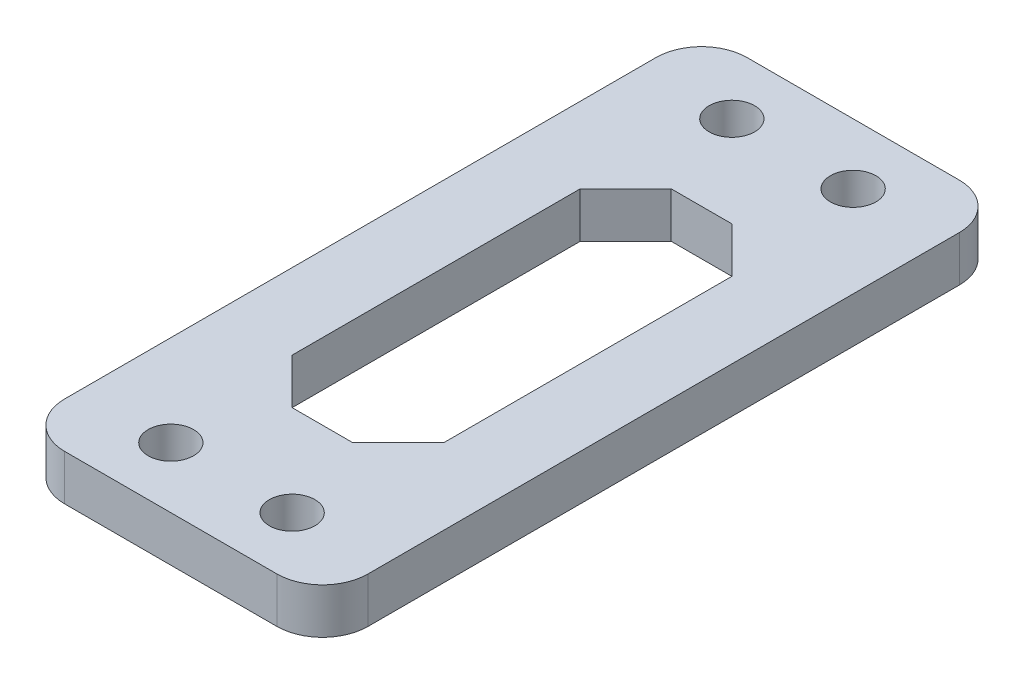
ISO-10303-21;
HEADER;
FILE_DESCRIPTION(('STEP AP214'),'2;1');
FILE_NAME('part.step','',(''),(''),'','','');
FILE_SCHEMA(('AUTOMOTIVE_DESIGN { 1 0 10303 214 1 1 1 1 }'));
ENDSEC;
DATA;
#1=APPLICATION_CONTEXT('core data for automotive mechanical design processes');
#2=APPLICATION_PROTOCOL_DEFINITION('international standard','automotive_design',2000,#1);
#3=PRODUCT_CONTEXT('',#1,'mechanical');
#4=PRODUCT('Part','Part','',(#3));
#5=PRODUCT_RELATED_PRODUCT_CATEGORY('part','',(#4));
#6=PRODUCT_DEFINITION_FORMATION('','',#4);
#7=PRODUCT_DEFINITION_CONTEXT('part definition',#1,'design');
#8=PRODUCT_DEFINITION('design','',#6,#7);
#9=PRODUCT_DEFINITION_SHAPE('','',#8);
#10=(LENGTH_UNIT() NAMED_UNIT(*) SI_UNIT(.MILLI.,.METRE.));
#11=(NAMED_UNIT(*) PLANE_ANGLE_UNIT() SI_UNIT($,.RADIAN.));
#12=(NAMED_UNIT(*) SI_UNIT($,.STERADIAN.) SOLID_ANGLE_UNIT());
#13=UNCERTAINTY_MEASURE_WITH_UNIT(LENGTH_MEASURE(1.E-05),#10,'distance_accuracy_value','');
#14=(GEOMETRIC_REPRESENTATION_CONTEXT(3) GLOBAL_UNCERTAINTY_ASSIGNED_CONTEXT((#13)) GLOBAL_UNIT_ASSIGNED_CONTEXT((#10,
#11,#12)) REPRESENTATION_CONTEXT('',''));
#15=CARTESIAN_POINT('',(0.,0.,0.));
#16=DIRECTION('',(0.,0.,1.));
#17=DIRECTION('',(1.,0.,0.));
#18=AXIS2_PLACEMENT_3D('',#15,#16,#17);
#19=CARTESIAN_POINT('',(0.,3.,0.));
#20=DIRECTION('',(0.,-1.,0.));
#21=DIRECTION('',(0.,0.,-1.));
#22=AXIS2_PLACEMENT_3D('',#19,#20,#21);
#23=PLANE('',#22);
#24=CARTESIAN_POINT('',(-4.,3.,18.5));
#25=DIRECTION('',(0.,1.,0.));
#26=DIRECTION('',(0.,0.,-1.));
#27=AXIS2_PLACEMENT_3D('',#24,#25,#26);
#28=CIRCLE('',#27,1.5);
#29=CARTESIAN_POINT('',(-4.,3.,17.));
#30=VERTEX_POINT('',#29);
#31=EDGE_CURVE('E333',#30,#30,#28,.T.);
#32=ORIENTED_EDGE('',*,*,#31,.F.);
#33=EDGE_LOOP('',(#32));
#34=FACE_BOUND('',#33,.T.);
#35=CARTESIAN_POINT('',(4.,3.,18.5));
#36=DIRECTION('',(0.,1.,0.));
#37=DIRECTION('',(0.,0.,1.));
#38=AXIS2_PLACEMENT_3D('',#35,#36,#37);
#39=CIRCLE('',#38,1.5);
#40=CARTESIAN_POINT('',(4.,3.,20.));
#41=VERTEX_POINT('',#40);
#42=EDGE_CURVE('E325',#41,#41,#39,.T.);
#43=ORIENTED_EDGE('',*,*,#42,.F.);
#44=EDGE_LOOP('',(#43));
#45=FACE_BOUND('',#44,.T.);
#46=CARTESIAN_POINT('',(4.,3.,-18.5));
#47=DIRECTION('',(0.,1.,0.));
#48=DIRECTION('',(0.,0.,-1.));
#49=AXIS2_PLACEMENT_3D('',#46,#47,#48);
#50=CIRCLE('',#49,1.5);
#51=CARTESIAN_POINT('',(4.,3.,-20.));
#52=VERTEX_POINT('',#51);
#53=EDGE_CURVE('E317',#52,#52,#50,.T.);
#54=ORIENTED_EDGE('',*,*,#53,.F.);
#55=EDGE_LOOP('',(#54));
#56=FACE_BOUND('',#55,.T.);
#57=CARTESIAN_POINT('',(-4.,3.,-18.5));
#58=DIRECTION('',(0.,1.,0.));
#59=DIRECTION('',(0.,0.,1.));
#60=AXIS2_PLACEMENT_3D('',#57,#58,#59);
#61=CIRCLE('',#60,1.5);
#62=CARTESIAN_POINT('',(-4.,3.,-17.));
#63=VERTEX_POINT('',#62);
#64=EDGE_CURVE('E302',#63,#63,#61,.T.);
#65=ORIENTED_EDGE('',*,*,#64,.F.);
#66=EDGE_LOOP('',(#65));
#67=FACE_BOUND('',#66,.T.);
#68=DIRECTION('',(0.,0.,1.));
#69=VECTOR('',#68,1.);
#70=CARTESIAN_POINT('',(-10.,3.,22.5));
#71=LINE('',#70,#69);
#72=CARTESIAN_POINT('',(-10.,3.,-19.5));
#73=VERTEX_POINT('',#72);
#74=CARTESIAN_POINT('',(-10.,3.,19.5));
#75=VERTEX_POINT('',#74);
#76=EDGE_CURVE('E194',#73,#75,#71,.T.);
#77=ORIENTED_EDGE('',*,*,#76,.T.);
#78=CARTESIAN_POINT('',(-7.,3.,19.5));
#79=DIRECTION('',(0.,-1.,0.));
#80=DIRECTION('',(0.,0.,-1.));
#81=AXIS2_PLACEMENT_3D('',#78,#79,#80);
#82=CIRCLE('',#81,3.);
#83=CARTESIAN_POINT('',(-7.,3.,22.5));
#84=VERTEX_POINT('',#83);
#85=EDGE_CURVE('E272',#75,#84,#82,.F.);
#86=ORIENTED_EDGE('',*,*,#85,.T.);
#87=DIRECTION('',(1.,0.,0.));
#88=VECTOR('',#87,1.);
#89=CARTESIAN_POINT('',(-10.,3.,22.5));
#90=LINE('',#89,#88);
#91=CARTESIAN_POINT('',(7.,3.,22.5));
#92=VERTEX_POINT('',#91);
#93=EDGE_CURVE('E187',#84,#92,#90,.T.);
#94=ORIENTED_EDGE('',*,*,#93,.T.);
#95=CARTESIAN_POINT('',(7.,3.,19.5));
#96=DIRECTION('',(0.,-1.,0.));
#97=DIRECTION('',(0.,0.,-1.));
#98=AXIS2_PLACEMENT_3D('',#95,#96,#97);
#99=CIRCLE('',#98,3.);
#100=CARTESIAN_POINT('',(10.,3.,19.5));
#101=VERTEX_POINT('',#100);
#102=EDGE_CURVE('E269',#92,#101,#99,.F.);
#103=ORIENTED_EDGE('',*,*,#102,.T.);
#104=DIRECTION('',(0.,0.,-1.));
#105=VECTOR('',#104,1.);
#106=CARTESIAN_POINT('',(10.,3.,22.5));
#107=LINE('',#106,#105);
#108=CARTESIAN_POINT('',(10.,3.,-19.5));
#109=VERTEX_POINT('',#108);
#110=EDGE_CURVE('E310',#101,#109,#107,.T.);
#111=ORIENTED_EDGE('',*,*,#110,.T.);
#112=CARTESIAN_POINT('',(7.,3.,-19.5));
#113=DIRECTION('',(0.,-1.,0.));
#114=DIRECTION('',(0.,0.,-1.));
#115=AXIS2_PLACEMENT_3D('',#112,#113,#114);
#116=CIRCLE('',#115,3.);
#117=CARTESIAN_POINT('',(7.,3.,-22.5));
#118=VERTEX_POINT('',#117);
#119=EDGE_CURVE('E66',#109,#118,#116,.F.);
#120=ORIENTED_EDGE('',*,*,#119,.T.);
#121=DIRECTION('',(-1.,0.,0.));
#122=VECTOR('',#121,1.);
#123=CARTESIAN_POINT('',(-10.,3.,-22.5));
#124=LINE('',#123,#122);
#125=CARTESIAN_POINT('',(-7.,3.,-22.5));
#126=VERTEX_POINT('',#125);
#127=EDGE_CURVE('E287',#118,#126,#124,.T.);
#128=ORIENTED_EDGE('',*,*,#127,.T.);
#129=CARTESIAN_POINT('',(-7.,3.,-19.5));
#130=DIRECTION('',(0.,-1.,0.));
#131=DIRECTION('',(0.,0.,-1.));
#132=AXIS2_PLACEMENT_3D('',#129,#130,#131);
#133=CIRCLE('',#132,3.);
#134=EDGE_CURVE('E266',#126,#73,#133,.F.);
#135=ORIENTED_EDGE('',*,*,#134,.T.);
#136=EDGE_LOOP('',(#77,#86,#94,#103,#111,#120,#128,#135));
#137=FACE_BOUND('',#136,.T.);
#138=DIRECTION('',(0.,0.,-1.));
#139=VECTOR('',#138,1.);
#140=CARTESIAN_POINT('',(5.,3.,12.5));
#141=LINE('',#140,#139);
#142=CARTESIAN_POINT('',(5.,3.,9.50000000000002));
#143=VERTEX_POINT('',#142);
#144=CARTESIAN_POINT('',(5.,3.,-9.49999999999998));
#145=VERTEX_POINT('',#144);
#146=EDGE_CURVE('E182',#143,#145,#141,.T.);
#147=ORIENTED_EDGE('',*,*,#146,.F.);
#148=DIRECTION('',(0.707106781186551,0.,-0.707106781186544));
#149=VECTOR('',#148,1.);
#150=CARTESIAN_POINT('',(7.24999999999998,3.,7.25000000000005));
#151=LINE('',#150,#149);
#152=CARTESIAN_POINT('',(1.99999999999998,3.,12.5));
#153=VERTEX_POINT('',#152);
#154=EDGE_CURVE('E171',#143,#153,#151,.F.);
#155=ORIENTED_EDGE('',*,*,#154,.T.);
#156=DIRECTION('',(1.,0.,0.));
#157=VECTOR('',#156,1.);
#158=CARTESIAN_POINT('',(-5.,3.,12.5));
#159=LINE('',#158,#157);
#160=CARTESIAN_POINT('',(-2.00000000000001,3.,12.5));
#161=VERTEX_POINT('',#160);
#162=EDGE_CURVE('E341',#161,#153,#159,.T.);
#163=ORIENTED_EDGE('',*,*,#162,.F.);
#164=DIRECTION('',(0.707106781186544,0.,0.707106781186551));
#165=VECTOR('',#164,1.);
#166=CARTESIAN_POINT('',(-7.25000000000002,3.,7.24999999999995));
#167=LINE('',#166,#165);
#168=CARTESIAN_POINT('',(-5.,3.,9.49999999999998));
#169=VERTEX_POINT('',#168);
#170=EDGE_CURVE('E170',#161,#169,#167,.F.);
#171=ORIENTED_EDGE('',*,*,#170,.T.);
#172=DIRECTION('',(0.,0.,1.));
#173=VECTOR('',#172,1.);
#174=CARTESIAN_POINT('',(-5.,3.,12.5));
#175=LINE('',#174,#173);
#176=CARTESIAN_POINT('',(-5.,3.,-9.5));
#177=VERTEX_POINT('',#176);
#178=EDGE_CURVE('E357',#177,#169,#175,.T.);
#179=ORIENTED_EDGE('',*,*,#178,.F.);
#180=DIRECTION('',(-0.707106781186551,0.,0.707106781186544));
#181=VECTOR('',#180,1.);
#182=CARTESIAN_POINT('',(-7.24999999999998,3.,-7.25000000000004));
#183=LINE('',#182,#181);
#184=CARTESIAN_POINT('',(-1.99999999999998,3.,-12.5));
#185=VERTEX_POINT('',#184);
#186=EDGE_CURVE('E235',#177,#185,#183,.F.);
#187=ORIENTED_EDGE('',*,*,#186,.T.);
#188=DIRECTION('',(-1.,0.,0.));
#189=VECTOR('',#188,1.);
#190=CARTESIAN_POINT('',(-5.,3.,-12.5));
#191=LINE('',#190,#189);
#192=CARTESIAN_POINT('',(2.00000000000002,3.,-12.5));
#193=VERTEX_POINT('',#192);
#194=EDGE_CURVE('E361',#193,#185,#191,.T.);
#195=ORIENTED_EDGE('',*,*,#194,.F.);
#196=DIRECTION('',(-0.707106781186543,0.,-0.707106781186552));
#197=VECTOR('',#196,1.);
#198=CARTESIAN_POINT('',(7.25000000000002,3.,-7.24999999999994));
#199=LINE('',#198,#197);
#200=EDGE_CURVE('E229',#193,#145,#199,.F.);
#201=ORIENTED_EDGE('',*,*,#200,.T.);
#202=EDGE_LOOP('',(#147,#155,#163,#171,#179,#187,#195,#201));
#203=FACE_BOUND('',#202,.T.);
#204=ADVANCED_FACE('F45',(#34,#45,#56,#67,#137,#203),#23,.F.);
#205=CARTESIAN_POINT('',(0.,0.,0.));
#206=DIRECTION('',(0.,-1.,0.));
#207=DIRECTION('',(0.,0.,-1.));
#208=AXIS2_PLACEMENT_3D('',#205,#206,#207);
#209=PLANE('',#208);
#210=CARTESIAN_POINT('',(4.,0.,18.5));
#211=DIRECTION('',(0.,1.,0.));
#212=DIRECTION('',(0.,0.,1.));
#213=AXIS2_PLACEMENT_3D('',#210,#211,#212);
#214=CIRCLE('',#213,1.5);
#215=CARTESIAN_POINT('',(4.,0.,20.));
#216=VERTEX_POINT('',#215);
#217=EDGE_CURVE('E329',#216,#216,#214,.T.);
#218=ORIENTED_EDGE('',*,*,#217,.T.);
#219=EDGE_LOOP('',(#218));
#220=FACE_BOUND('',#219,.T.);
#221=CARTESIAN_POINT('',(-4.,0.,-18.5));
#222=DIRECTION('',(0.,1.,0.));
#223=DIRECTION('',(0.,0.,1.));
#224=AXIS2_PLACEMENT_3D('',#221,#222,#223);
#225=CIRCLE('',#224,1.5);
#226=CARTESIAN_POINT('',(-4.,0.,-17.));
#227=VERTEX_POINT('',#226);
#228=EDGE_CURVE('E313',#227,#227,#225,.T.);
#229=ORIENTED_EDGE('',*,*,#228,.T.);
#230=EDGE_LOOP('',(#229));
#231=FACE_BOUND('',#230,.T.);
#232=DIRECTION('',(1.,0.,0.));
#233=VECTOR('',#232,1.);
#234=CARTESIAN_POINT('',(-10.,0.,22.5));
#235=LINE('',#234,#233);
#236=CARTESIAN_POINT('',(-7.,0.,22.5));
#237=VERTEX_POINT('',#236);
#238=CARTESIAN_POINT('',(7.,0.,22.5));
#239=VERTEX_POINT('',#238);
#240=EDGE_CURVE('E197',#237,#239,#235,.T.);
#241=ORIENTED_EDGE('',*,*,#240,.F.);
#242=CARTESIAN_POINT('',(-7.,0.,19.5));
#243=DIRECTION('',(0.,-1.,0.));
#244=DIRECTION('',(0.,0.,-1.));
#245=AXIS2_PLACEMENT_3D('',#242,#243,#244);
#246=CIRCLE('',#245,3.);
#247=CARTESIAN_POINT('',(-10.,0.,19.5));
#248=VERTEX_POINT('',#247);
#249=EDGE_CURVE('E254',#237,#248,#246,.T.);
#250=ORIENTED_EDGE('',*,*,#249,.T.);
#251=DIRECTION('',(0.,0.,1.));
#252=VECTOR('',#251,1.);
#253=CARTESIAN_POINT('',(-10.,0.,22.5));
#254=LINE('',#253,#252);
#255=CARTESIAN_POINT('',(-10.,0.,-19.5));
#256=VERTEX_POINT('',#255);
#257=EDGE_CURVE('E296',#256,#248,#254,.T.);
#258=ORIENTED_EDGE('',*,*,#257,.F.);
#259=CARTESIAN_POINT('',(-7.,0.,-19.5));
#260=DIRECTION('',(0.,-1.,0.));
#261=DIRECTION('',(0.,0.,-1.));
#262=AXIS2_PLACEMENT_3D('',#259,#260,#261);
#263=CIRCLE('',#262,3.);
#264=CARTESIAN_POINT('',(-7.,0.,-22.5));
#265=VERTEX_POINT('',#264);
#266=EDGE_CURVE('E248',#256,#265,#263,.T.);
#267=ORIENTED_EDGE('',*,*,#266,.T.);
#268=DIRECTION('',(-1.,0.,0.));
#269=VECTOR('',#268,1.);
#270=CARTESIAN_POINT('',(-10.,0.,-22.5));
#271=LINE('',#270,#269);
#272=CARTESIAN_POINT('',(7.,0.,-22.5));
#273=VERTEX_POINT('',#272);
#274=EDGE_CURVE('E286',#273,#265,#271,.T.);
#275=ORIENTED_EDGE('',*,*,#274,.F.);
#276=CARTESIAN_POINT('',(7.,0.,-19.5));
#277=DIRECTION('',(0.,-1.,0.));
#278=DIRECTION('',(0.,0.,-1.));
#279=AXIS2_PLACEMENT_3D('',#276,#277,#278);
#280=CIRCLE('',#279,3.);
#281=CARTESIAN_POINT('',(10.,0.,-19.5));
#282=VERTEX_POINT('',#281);
#283=EDGE_CURVE('E245',#273,#282,#280,.T.);
#284=ORIENTED_EDGE('',*,*,#283,.T.);
#285=DIRECTION('',(0.,0.,-1.));
#286=VECTOR('',#285,1.);
#287=CARTESIAN_POINT('',(10.,0.,22.5));
#288=LINE('',#287,#286);
#289=CARTESIAN_POINT('',(10.,0.,19.5));
#290=VERTEX_POINT('',#289);
#291=EDGE_CURVE('E297',#290,#282,#288,.T.);
#292=ORIENTED_EDGE('',*,*,#291,.F.);
#293=CARTESIAN_POINT('',(7.,0.,19.5));
#294=DIRECTION('',(0.,-1.,0.));
#295=DIRECTION('',(0.,0.,-1.));
#296=AXIS2_PLACEMENT_3D('',#293,#294,#295);
#297=CIRCLE('',#296,3.);
#298=EDGE_CURVE('E251',#290,#239,#297,.T.);
#299=ORIENTED_EDGE('',*,*,#298,.T.);
#300=EDGE_LOOP('',(#241,#250,#258,#267,#275,#284,#292,#299));
#301=FACE_BOUND('',#300,.T.);
#302=CARTESIAN_POINT('',(4.,0.,-18.5));
#303=DIRECTION('',(0.,1.,0.));
#304=DIRECTION('',(0.,0.,-1.));
#305=AXIS2_PLACEMENT_3D('',#302,#303,#304);
#306=CIRCLE('',#305,1.5);
#307=CARTESIAN_POINT('',(4.,0.,-20.));
#308=VERTEX_POINT('',#307);
#309=EDGE_CURVE('E321',#308,#308,#306,.T.);
#310=ORIENTED_EDGE('',*,*,#309,.T.);
#311=EDGE_LOOP('',(#310));
#312=FACE_BOUND('',#311,.T.);
#313=CARTESIAN_POINT('',(-4.,0.,18.5));
#314=DIRECTION('',(0.,1.,0.));
#315=DIRECTION('',(0.,0.,-1.));
#316=AXIS2_PLACEMENT_3D('',#313,#314,#315);
#317=CIRCLE('',#316,1.5);
#318=CARTESIAN_POINT('',(-4.,0.,17.));
#319=VERTEX_POINT('',#318);
#320=EDGE_CURVE('E337',#319,#319,#317,.T.);
#321=ORIENTED_EDGE('',*,*,#320,.T.);
#322=EDGE_LOOP('',(#321));
#323=FACE_BOUND('',#322,.T.);
#324=DIRECTION('',(0.,0.,1.));
#325=VECTOR('',#324,1.);
#326=CARTESIAN_POINT('',(-5.,0.,12.5));
#327=LINE('',#326,#325);
#328=CARTESIAN_POINT('',(-5.,0.,-9.5));
#329=VERTEX_POINT('',#328);
#330=CARTESIAN_POINT('',(-5.,0.,9.49999999999998));
#331=VERTEX_POINT('',#330);
#332=EDGE_CURVE('E164',#329,#331,#327,.T.);
#333=ORIENTED_EDGE('',*,*,#332,.T.);
#334=DIRECTION('',(-0.707106781186544,0.,-0.707106781186551));
#335=VECTOR('',#334,1.);
#336=CARTESIAN_POINT('',(-5.,0.,9.49999999999998));
#337=LINE('',#336,#335);
#338=CARTESIAN_POINT('',(-2.00000000000001,0.,12.5));
#339=VERTEX_POINT('',#338);
#340=EDGE_CURVE('E159',#331,#339,#337,.F.);
#341=ORIENTED_EDGE('',*,*,#340,.T.);
#342=DIRECTION('',(1.,0.,0.));
#343=VECTOR('',#342,1.);
#344=CARTESIAN_POINT('',(-5.,0.,12.5));
#345=LINE('',#344,#343);
#346=CARTESIAN_POINT('',(1.99999999999998,0.,12.5));
#347=VERTEX_POINT('',#346);
#348=EDGE_CURVE('E162',#339,#347,#345,.T.);
#349=ORIENTED_EDGE('',*,*,#348,.T.);
#350=DIRECTION('',(-0.707106781186551,0.,0.707106781186544));
#351=VECTOR('',#350,1.);
#352=CARTESIAN_POINT('',(1.99999999999998,0.,12.5));
#353=LINE('',#352,#351);
#354=CARTESIAN_POINT('',(5.,0.,9.50000000000002));
#355=VERTEX_POINT('',#354);
#356=EDGE_CURVE('E219',#347,#355,#353,.F.);
#357=ORIENTED_EDGE('',*,*,#356,.T.);
#358=DIRECTION('',(0.,0.,-1.));
#359=VECTOR('',#358,1.);
#360=CARTESIAN_POINT('',(5.,0.,12.5));
#361=LINE('',#360,#359);
#362=CARTESIAN_POINT('',(5.,0.,-9.49999999999998));
#363=VERTEX_POINT('',#362);
#364=EDGE_CURVE('E351',#355,#363,#361,.T.);
#365=ORIENTED_EDGE('',*,*,#364,.T.);
#366=DIRECTION('',(0.707106781186543,0.,0.707106781186552));
#367=VECTOR('',#366,1.);
#368=CARTESIAN_POINT('',(5.,0.,-9.49999999999998));
#369=LINE('',#368,#367);
#370=CARTESIAN_POINT('',(2.00000000000002,0.,-12.5));
#371=VERTEX_POINT('',#370);
#372=EDGE_CURVE('E226',#363,#371,#369,.F.);
#373=ORIENTED_EDGE('',*,*,#372,.T.);
#374=DIRECTION('',(-1.,0.,0.));
#375=VECTOR('',#374,1.);
#376=CARTESIAN_POINT('',(-5.,0.,-12.5));
#377=LINE('',#376,#375);
#378=CARTESIAN_POINT('',(-1.99999999999998,0.,-12.5));
#379=VERTEX_POINT('',#378);
#380=EDGE_CURVE('E347',#371,#379,#377,.T.);
#381=ORIENTED_EDGE('',*,*,#380,.T.);
#382=DIRECTION('',(0.707106781186551,0.,-0.707106781186544));
#383=VECTOR('',#382,1.);
#384=CARTESIAN_POINT('',(-1.99999999999998,0.,-12.5));
#385=LINE('',#384,#383);
#386=EDGE_CURVE('E232',#379,#329,#385,.F.);
#387=ORIENTED_EDGE('',*,*,#386,.T.);
#388=EDGE_LOOP('',(#333,#341,#349,#357,#365,#373,#381,#387));
#389=FACE_BOUND('',#388,.T.);
#390=ADVANCED_FACE('F161',(#220,#231,#301,#312,#323,#389),#209,.T.);
#391=CARTESIAN_POINT('',(10.,3.,22.5));
#392=DIRECTION('',(-1.,0.,0.));
#393=DIRECTION('',(0.,0.,1.));
#394=AXIS2_PLACEMENT_3D('',#391,#392,#393);
#395=PLANE('',#394);
#396=ORIENTED_EDGE('',*,*,#110,.F.);
#397=DIRECTION('',(0.,-1.,0.));
#398=VECTOR('',#397,1.);
#399=CARTESIAN_POINT('',(10.,3.,19.5));
#400=LINE('',#399,#398);
#401=EDGE_CURVE('E278',#101,#290,#400,.T.);
#402=ORIENTED_EDGE('',*,*,#401,.T.);
#403=ORIENTED_EDGE('',*,*,#291,.T.);
#404=DIRECTION('',(0.,-1.,0.));
#405=VECTOR('',#404,1.);
#406=CARTESIAN_POINT('',(10.,3.,-19.5));
#407=LINE('',#406,#405);
#408=EDGE_CURVE('E275',#282,#109,#407,.F.);
#409=ORIENTED_EDGE('',*,*,#408,.T.);
#410=EDGE_LOOP('',(#396,#402,#403,#409));
#411=FACE_BOUND('',#410,.T.);
#412=ADVANCED_FACE('F409',(#411),#395,.F.);
#413=CARTESIAN_POINT('',(-10.,3.,-22.5));
#414=DIRECTION('',(0.,0.,1.));
#415=DIRECTION('',(1.,0.,0.));
#416=AXIS2_PLACEMENT_3D('',#413,#414,#415);
#417=PLANE('',#416);
#418=ORIENTED_EDGE('',*,*,#274,.T.);
#419=DIRECTION('',(0.,-1.,0.));
#420=VECTOR('',#419,1.);
#421=CARTESIAN_POINT('',(-7.,3.,-22.5));
#422=LINE('',#421,#420);
#423=EDGE_CURVE('E11',#265,#126,#422,.F.);
#424=ORIENTED_EDGE('',*,*,#423,.T.);
#425=ORIENTED_EDGE('',*,*,#127,.F.);
#426=DIRECTION('',(0.,-1.,0.));
#427=VECTOR('',#426,1.);
#428=CARTESIAN_POINT('',(7.,3.,-22.5));
#429=LINE('',#428,#427);
#430=EDGE_CURVE('E54',#118,#273,#429,.T.);
#431=ORIENTED_EDGE('',*,*,#430,.T.);
#432=EDGE_LOOP('',(#418,#424,#425,#431));
#433=FACE_BOUND('',#432,.T.);
#434=ADVANCED_FACE('F285',(#433),#417,.F.);
#435=CARTESIAN_POINT('',(-10.,3.,22.5));
#436=DIRECTION('',(1.,0.,0.));
#437=DIRECTION('',(0.,0.,-1.));
#438=AXIS2_PLACEMENT_3D('',#435,#436,#437);
#439=PLANE('',#438);
#440=ORIENTED_EDGE('',*,*,#257,.T.);
#441=DIRECTION('',(0.,-1.,0.));
#442=VECTOR('',#441,1.);
#443=CARTESIAN_POINT('',(-10.,3.,19.5));
#444=LINE('',#443,#442);
#445=EDGE_CURVE('E261',#248,#75,#444,.F.);
#446=ORIENTED_EDGE('',*,*,#445,.T.);
#447=ORIENTED_EDGE('',*,*,#76,.F.);
#448=DIRECTION('',(0.,-1.,0.));
#449=VECTOR('',#448,1.);
#450=CARTESIAN_POINT('',(-10.,3.,-19.5));
#451=LINE('',#450,#449);
#452=EDGE_CURVE('E257',#73,#256,#451,.T.);
#453=ORIENTED_EDGE('',*,*,#452,.T.);
#454=EDGE_LOOP('',(#440,#446,#447,#453));
#455=FACE_BOUND('',#454,.T.);
#456=ADVANCED_FACE('F421',(#455),#439,.F.);
#457=CARTESIAN_POINT('',(-10.,3.,22.5));
#458=DIRECTION('',(0.,0.,-1.));
#459=DIRECTION('',(-1.,0.,0.));
#460=AXIS2_PLACEMENT_3D('',#457,#458,#459);
#461=PLANE('',#460);
#462=ORIENTED_EDGE('',*,*,#93,.F.);
#463=DIRECTION('',(0.,-1.,0.));
#464=VECTOR('',#463,1.);
#465=CARTESIAN_POINT('',(-7.,3.,22.5));
#466=LINE('',#465,#464);
#467=EDGE_CURVE('E241',#84,#237,#466,.T.);
#468=ORIENTED_EDGE('',*,*,#467,.T.);
#469=ORIENTED_EDGE('',*,*,#240,.T.);
#470=DIRECTION('',(0.,-1.,0.));
#471=VECTOR('',#470,1.);
#472=CARTESIAN_POINT('',(7.,3.,22.5));
#473=LINE('',#472,#471);
#474=EDGE_CURVE('E238',#239,#92,#473,.F.);
#475=ORIENTED_EDGE('',*,*,#474,.T.);
#476=EDGE_LOOP('',(#462,#468,#469,#475));
#477=FACE_BOUND('',#476,.T.);
#478=ADVANCED_FACE('F418',(#477),#461,.F.);
#479=CARTESIAN_POINT('',(-4.,3.,-18.5));
#480=DIRECTION('',(0.,-1.,0.));
#481=DIRECTION('',(0.,0.,-1.));
#482=AXIS2_PLACEMENT_3D('',#479,#480,#481);
#483=CYLINDRICAL_SURFACE('',#482,1.5);
#484=ORIENTED_EDGE('',*,*,#64,.T.);
#485=EDGE_LOOP('',(#484));
#486=FACE_BOUND('',#485,.T.);
#487=ORIENTED_EDGE('',*,*,#228,.F.);
#488=EDGE_LOOP('',(#487));
#489=FACE_BOUND('',#488,.T.);
#490=ADVANCED_FACE('F415',(#486,#489),#483,.F.);
#491=CARTESIAN_POINT('',(4.,3.,-18.5));
#492=DIRECTION('',(0.,-1.,0.));
#493=DIRECTION('',(0.,0.,-1.));
#494=AXIS2_PLACEMENT_3D('',#491,#492,#493);
#495=CYLINDRICAL_SURFACE('',#494,1.5);
#496=ORIENTED_EDGE('',*,*,#53,.T.);
#497=EDGE_LOOP('',(#496));
#498=FACE_BOUND('',#497,.T.);
#499=ORIENTED_EDGE('',*,*,#309,.F.);
#500=EDGE_LOOP('',(#499));
#501=FACE_BOUND('',#500,.T.);
#502=ADVANCED_FACE('F579',(#498,#501),#495,.F.);
#503=CARTESIAN_POINT('',(4.,3.,18.5));
#504=DIRECTION('',(0.,-1.,0.));
#505=DIRECTION('',(0.,0.,-1.));
#506=AXIS2_PLACEMENT_3D('',#503,#504,#505);
#507=CYLINDRICAL_SURFACE('',#506,1.5);
#508=ORIENTED_EDGE('',*,*,#42,.T.);
#509=EDGE_LOOP('',(#508));
#510=FACE_BOUND('',#509,.T.);
#511=ORIENTED_EDGE('',*,*,#217,.F.);
#512=EDGE_LOOP('',(#511));
#513=FACE_BOUND('',#512,.T.);
#514=ADVANCED_FACE('F569',(#510,#513),#507,.F.);
#515=CARTESIAN_POINT('',(-4.,3.,18.5));
#516=DIRECTION('',(0.,-1.,0.));
#517=DIRECTION('',(0.,0.,-1.));
#518=AXIS2_PLACEMENT_3D('',#515,#516,#517);
#519=CYLINDRICAL_SURFACE('',#518,1.5);
#520=ORIENTED_EDGE('',*,*,#31,.T.);
#521=EDGE_LOOP('',(#520));
#522=FACE_BOUND('',#521,.T.);
#523=ORIENTED_EDGE('',*,*,#320,.F.);
#524=EDGE_LOOP('',(#523));
#525=FACE_BOUND('',#524,.T.);
#526=ADVANCED_FACE('F560',(#522,#525),#519,.F.);
#527=CARTESIAN_POINT('',(5.,3.,12.5));
#528=DIRECTION('',(-1.,0.,0.));
#529=DIRECTION('',(0.,0.,1.));
#530=AXIS2_PLACEMENT_3D('',#527,#528,#529);
#531=PLANE('',#530);
#532=ORIENTED_EDGE('',*,*,#364,.F.);
#533=DIRECTION('',(0.,1.,0.));
#534=VECTOR('',#533,1.);
#535=CARTESIAN_POINT('',(5.,3.,9.50000000000002));
#536=LINE('',#535,#534);
#537=EDGE_CURVE('E203',#355,#143,#536,.T.);
#538=ORIENTED_EDGE('',*,*,#537,.T.);
#539=ORIENTED_EDGE('',*,*,#146,.T.);
#540=DIRECTION('',(0.,-1.,0.));
#541=VECTOR('',#540,1.);
#542=CARTESIAN_POINT('',(5.,0.,-9.49999999999998));
#543=LINE('',#542,#541);
#544=EDGE_CURVE('E191',#145,#363,#543,.T.);
#545=ORIENTED_EDGE('',*,*,#544,.T.);
#546=EDGE_LOOP('',(#532,#538,#539,#545));
#547=FACE_BOUND('',#546,.T.);
#548=ADVANCED_FACE('F371',(#547),#531,.T.);
#549=CARTESIAN_POINT('',(-5.,3.,-12.5));
#550=DIRECTION('',(0.,0.,1.));
#551=DIRECTION('',(1.,0.,0.));
#552=AXIS2_PLACEMENT_3D('',#549,#550,#551);
#553=PLANE('',#552);
#554=ORIENTED_EDGE('',*,*,#380,.F.);
#555=DIRECTION('',(0.,1.,0.));
#556=VECTOR('',#555,1.);
#557=CARTESIAN_POINT('',(2.00000000000002,3.,-12.5));
#558=LINE('',#557,#556);
#559=EDGE_CURVE('E216',#371,#193,#558,.T.);
#560=ORIENTED_EDGE('',*,*,#559,.T.);
#561=ORIENTED_EDGE('',*,*,#194,.T.);
#562=DIRECTION('',(0.,-1.,0.));
#563=VECTOR('',#562,1.);
#564=CARTESIAN_POINT('',(-1.99999999999998,0.,-12.5));
#565=LINE('',#564,#563);
#566=EDGE_CURVE('E212',#185,#379,#565,.T.);
#567=ORIENTED_EDGE('',*,*,#566,.T.);
#568=EDGE_LOOP('',(#554,#560,#561,#567));
#569=FACE_BOUND('',#568,.T.);
#570=ADVANCED_FACE('F381',(#569),#553,.T.);
#571=CARTESIAN_POINT('',(-5.,3.,12.5));
#572=DIRECTION('',(1.,0.,0.));
#573=DIRECTION('',(0.,0.,-1.));
#574=AXIS2_PLACEMENT_3D('',#571,#572,#573);
#575=PLANE('',#574);
#576=ORIENTED_EDGE('',*,*,#178,.T.);
#577=DIRECTION('',(0.,-1.,0.));
#578=VECTOR('',#577,1.);
#579=CARTESIAN_POINT('',(-5.,0.,9.49999999999998));
#580=LINE('',#579,#578);
#581=EDGE_CURVE('E209',#169,#331,#580,.T.);
#582=ORIENTED_EDGE('',*,*,#581,.T.);
#583=ORIENTED_EDGE('',*,*,#332,.F.);
#584=DIRECTION('',(0.,1.,0.));
#585=VECTOR('',#584,1.);
#586=CARTESIAN_POINT('',(-5.,3.,-9.5));
#587=LINE('',#586,#585);
#588=EDGE_CURVE('E206',#329,#177,#587,.T.);
#589=ORIENTED_EDGE('',*,*,#588,.T.);
#590=EDGE_LOOP('',(#576,#582,#583,#589));
#591=FACE_BOUND('',#590,.T.);
#592=ADVANCED_FACE('F389',(#591),#575,.T.);
#593=CARTESIAN_POINT('',(-5.,3.,12.5));
#594=DIRECTION('',(0.,0.,-1.));
#595=DIRECTION('',(-1.,0.,0.));
#596=AXIS2_PLACEMENT_3D('',#593,#594,#595);
#597=PLANE('',#596);
#598=ORIENTED_EDGE('',*,*,#162,.T.);
#599=DIRECTION('',(0.,-1.,0.));
#600=VECTOR('',#599,1.);
#601=CARTESIAN_POINT('',(1.99999999999998,0.,12.5));
#602=LINE('',#601,#600);
#603=EDGE_CURVE('E180',#153,#347,#602,.T.);
#604=ORIENTED_EDGE('',*,*,#603,.T.);
#605=ORIENTED_EDGE('',*,*,#348,.F.);
#606=DIRECTION('',(0.,1.,0.));
#607=VECTOR('',#606,1.);
#608=CARTESIAN_POINT('',(-2.00000000000001,3.,12.5));
#609=LINE('',#608,#607);
#610=EDGE_CURVE('E177',#339,#161,#609,.T.);
#611=ORIENTED_EDGE('',*,*,#610,.T.);
#612=EDGE_LOOP('',(#598,#604,#605,#611));
#613=FACE_BOUND('',#612,.T.);
#614=ADVANCED_FACE('F176',(#613),#597,.T.);
#615=CARTESIAN_POINT('',(1.99999999999998,3.,12.5));
#616=DIRECTION('',(-0.707106781186544,0.,-0.707106781186551));
#617=DIRECTION('',(0.,1.,0.));
#618=AXIS2_PLACEMENT_3D('',#615,#616,#617);
#619=PLANE('',#618);
#620=ORIENTED_EDGE('',*,*,#154,.F.);
#621=ORIENTED_EDGE('',*,*,#537,.F.);
#622=ORIENTED_EDGE('',*,*,#356,.F.);
#623=ORIENTED_EDGE('',*,*,#603,.F.);
#624=EDGE_LOOP('',(#620,#621,#622,#623));
#625=FACE_BOUND('',#624,.T.);
#626=ADVANCED_FACE('F392',(#625),#619,.T.);
#627=CARTESIAN_POINT('',(-5.,3.,9.49999999999998));
#628=DIRECTION('',(0.707106781186551,0.,-0.707106781186544));
#629=DIRECTION('',(0.,1.,0.));
#630=AXIS2_PLACEMENT_3D('',#627,#628,#629);
#631=PLANE('',#630);
#632=ORIENTED_EDGE('',*,*,#170,.F.);
#633=ORIENTED_EDGE('',*,*,#610,.F.);
#634=ORIENTED_EDGE('',*,*,#340,.F.);
#635=ORIENTED_EDGE('',*,*,#581,.F.);
#636=EDGE_LOOP('',(#632,#633,#634,#635));
#637=FACE_BOUND('',#636,.T.);
#638=ADVANCED_FACE('F185',(#637),#631,.T.);
#639=CARTESIAN_POINT('',(5.,3.,-9.49999999999998));
#640=DIRECTION('',(-0.707106781186552,0.,0.707106781186543));
#641=DIRECTION('',(0.,1.,0.));
#642=AXIS2_PLACEMENT_3D('',#639,#640,#641);
#643=PLANE('',#642);
#644=ORIENTED_EDGE('',*,*,#200,.F.);
#645=ORIENTED_EDGE('',*,*,#559,.F.);
#646=ORIENTED_EDGE('',*,*,#372,.F.);
#647=ORIENTED_EDGE('',*,*,#544,.F.);
#648=EDGE_LOOP('',(#644,#645,#646,#647));
#649=FACE_BOUND('',#648,.T.);
#650=ADVANCED_FACE('F377',(#649),#643,.T.);
#651=CARTESIAN_POINT('',(-1.99999999999998,3.,-12.5));
#652=DIRECTION('',(0.707106781186544,0.,0.707106781186551));
#653=DIRECTION('',(0.,1.,0.));
#654=AXIS2_PLACEMENT_3D('',#651,#652,#653);
#655=PLANE('',#654);
#656=ORIENTED_EDGE('',*,*,#186,.F.);
#657=ORIENTED_EDGE('',*,*,#588,.F.);
#658=ORIENTED_EDGE('',*,*,#386,.F.);
#659=ORIENTED_EDGE('',*,*,#566,.F.);
#660=EDGE_LOOP('',(#656,#657,#658,#659));
#661=FACE_BOUND('',#660,.T.);
#662=ADVANCED_FACE('F386',(#661),#655,.T.);
#663=CARTESIAN_POINT('',(-7.,3.,19.5));
#664=DIRECTION('',(0.,-1.,0.));
#665=DIRECTION('',(0.,0.,-1.));
#666=AXIS2_PLACEMENT_3D('',#663,#664,#665);
#667=CYLINDRICAL_SURFACE('',#666,3.);
#668=ORIENTED_EDGE('',*,*,#85,.F.);
#669=ORIENTED_EDGE('',*,*,#445,.F.);
#670=ORIENTED_EDGE('',*,*,#249,.F.);
#671=ORIENTED_EDGE('',*,*,#467,.F.);
#672=EDGE_LOOP('',(#668,#669,#670,#671));
#673=FACE_BOUND('',#672,.T.);
#674=ADVANCED_FACE('F444',(#673),#667,.T.);
#675=CARTESIAN_POINT('',(7.,3.,19.5));
#676=DIRECTION('',(0.,-1.,0.));
#677=DIRECTION('',(0.,0.,-1.));
#678=AXIS2_PLACEMENT_3D('',#675,#676,#677);
#679=CYLINDRICAL_SURFACE('',#678,3.);
#680=ORIENTED_EDGE('',*,*,#102,.F.);
#681=ORIENTED_EDGE('',*,*,#474,.F.);
#682=ORIENTED_EDGE('',*,*,#298,.F.);
#683=ORIENTED_EDGE('',*,*,#401,.F.);
#684=EDGE_LOOP('',(#680,#681,#682,#683));
#685=FACE_BOUND('',#684,.T.);
#686=ADVANCED_FACE('F436',(#685),#679,.T.);
#687=CARTESIAN_POINT('',(-7.,3.,-19.5));
#688=DIRECTION('',(0.,-1.,0.));
#689=DIRECTION('',(0.,0.,-1.));
#690=AXIS2_PLACEMENT_3D('',#687,#688,#689);
#691=CYLINDRICAL_SURFACE('',#690,3.);
#692=ORIENTED_EDGE('',*,*,#134,.F.);
#693=ORIENTED_EDGE('',*,*,#423,.F.);
#694=ORIENTED_EDGE('',*,*,#266,.F.);
#695=ORIENTED_EDGE('',*,*,#452,.F.);
#696=EDGE_LOOP('',(#692,#693,#694,#695));
#697=FACE_BOUND('',#696,.T.);
#698=ADVANCED_FACE('F450',(#697),#691,.T.);
#699=CARTESIAN_POINT('',(7.,3.,-19.5));
#700=DIRECTION('',(0.,-1.,0.));
#701=DIRECTION('',(0.,0.,-1.));
#702=AXIS2_PLACEMENT_3D('',#699,#700,#701);
#703=CYLINDRICAL_SURFACE('',#702,3.);
#704=ORIENTED_EDGE('',*,*,#119,.F.);
#705=ORIENTED_EDGE('',*,*,#408,.F.);
#706=ORIENTED_EDGE('',*,*,#283,.F.);
#707=ORIENTED_EDGE('',*,*,#430,.F.);
#708=EDGE_LOOP('',(#704,#705,#706,#707));
#709=FACE_BOUND('',#708,.T.);
#710=ADVANCED_FACE('F47',(#709),#703,.T.);
#711=CLOSED_SHELL('',(#204,#390,#412,#434,#456,#478,#490,#502,#514,#526,#548,#570,#592,#614,
#626,#638,#650,#662,#674,#686,#698,#710));
#712=MANIFOLD_SOLID_BREP('B2',#711);
#713=ADVANCED_BREP_SHAPE_REPRESENTATION('',(#18,#712),#14);
#714=SHAPE_DEFINITION_REPRESENTATION(#9,#713);
ENDSEC;
END-ISO-10303-21;
